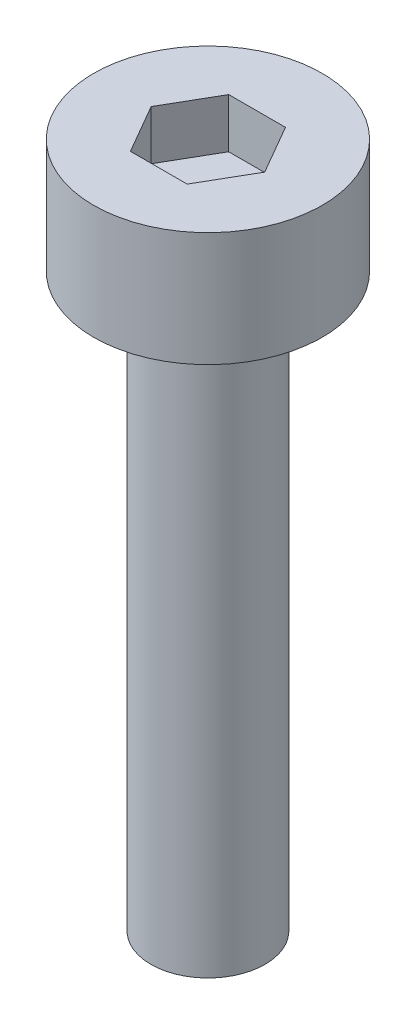
ISO-10303-21;
HEADER;
FILE_DESCRIPTION(('STEP AP214'),'2;1');
FILE_NAME('part.step','',(''),(''),'','','');
FILE_SCHEMA(('AUTOMOTIVE_DESIGN { 1 0 10303 214 1 1 1 1 }'));
ENDSEC;
DATA;
#1=APPLICATION_CONTEXT('core data for automotive mechanical design processes');
#2=APPLICATION_PROTOCOL_DEFINITION('international standard','automotive_design',2000,#1);
#3=PRODUCT_CONTEXT('',#1,'mechanical');
#4=PRODUCT('Part','Part','',(#3));
#5=PRODUCT_RELATED_PRODUCT_CATEGORY('part','',(#4));
#6=PRODUCT_DEFINITION_FORMATION('','',#4);
#7=PRODUCT_DEFINITION_CONTEXT('part definition',#1,'design');
#8=PRODUCT_DEFINITION('design','',#6,#7);
#9=PRODUCT_DEFINITION_SHAPE('','',#8);
#10=(LENGTH_UNIT() NAMED_UNIT(*) SI_UNIT(.MILLI.,.METRE.));
#11=(NAMED_UNIT(*) PLANE_ANGLE_UNIT() SI_UNIT($,.RADIAN.));
#12=(NAMED_UNIT(*) SI_UNIT($,.STERADIAN.) SOLID_ANGLE_UNIT());
#13=UNCERTAINTY_MEASURE_WITH_UNIT(LENGTH_MEASURE(1.E-05),#10,'distance_accuracy_value','');
#14=(GEOMETRIC_REPRESENTATION_CONTEXT(3) GLOBAL_UNCERTAINTY_ASSIGNED_CONTEXT((#13)) GLOBAL_UNIT_ASSIGNED_CONTEXT((#10,
#11,#12)) REPRESENTATION_CONTEXT('',''));
#15=CARTESIAN_POINT('',(0.,0.,0.));
#16=DIRECTION('',(0.,0.,1.));
#17=DIRECTION('',(1.,0.,0.));
#18=AXIS2_PLACEMENT_3D('',#15,#16,#17);
#19=CARTESIAN_POINT('',(0.,15.,0.));
#20=DIRECTION('',(0.,-1.,0.));
#21=DIRECTION('',(0.,0.,-1.));
#22=AXIS2_PLACEMENT_3D('',#19,#20,#21);
#23=CYLINDRICAL_SURFACE('',#22,1.5);
#24=CARTESIAN_POINT('',(0.,15.,0.));
#25=DIRECTION('',(0.,1.,0.));
#26=DIRECTION('',(0.,0.,1.));
#27=AXIS2_PLACEMENT_3D('',#24,#25,#26);
#28=CIRCLE('',#27,1.5);
#29=CARTESIAN_POINT('',(0.,15.,1.5));
#30=VERTEX_POINT('',#29);
#31=EDGE_CURVE('E11',#30,#30,#28,.T.);
#32=ORIENTED_EDGE('',*,*,#31,.F.);
#33=EDGE_LOOP('',(#32));
#34=FACE_BOUND('',#33,.T.);
#35=CARTESIAN_POINT('',(0.,0.,0.));
#36=DIRECTION('',(0.,1.,0.));
#37=DIRECTION('',(0.,0.,1.));
#38=AXIS2_PLACEMENT_3D('',#35,#36,#37);
#39=CIRCLE('',#38,1.5);
#40=CARTESIAN_POINT('',(0.,0.,1.5));
#41=VERTEX_POINT('',#40);
#42=EDGE_CURVE('E38',#41,#41,#39,.T.);
#43=ORIENTED_EDGE('',*,*,#42,.T.);
#44=EDGE_LOOP('',(#43));
#45=FACE_BOUND('',#44,.T.);
#46=ADVANCED_FACE('F35',(#34,#45),#23,.T.);
#47=CARTESIAN_POINT('',(0.,0.,0.));
#48=DIRECTION('',(0.,1.,0.));
#49=DIRECTION('',(0.,0.,1.));
#50=AXIS2_PLACEMENT_3D('',#47,#48,#49);
#51=PLANE('',#50);
#52=ORIENTED_EDGE('',*,*,#42,.F.);
#53=EDGE_LOOP('',(#52));
#54=FACE_BOUND('',#53,.T.);
#55=ADVANCED_FACE('F166',(#54),#51,.F.);
#56=CARTESIAN_POINT('',(0.,18.,0.));
#57=DIRECTION('',(0.,-1.,0.));
#58=DIRECTION('',(0.,0.,-1.));
#59=AXIS2_PLACEMENT_3D('',#56,#57,#58);
#60=CYLINDRICAL_SURFACE('',#59,3.);
#61=CARTESIAN_POINT('',(0.,18.,0.));
#62=DIRECTION('',(0.,1.,0.));
#63=DIRECTION('',(0.,0.,1.));
#64=AXIS2_PLACEMENT_3D('',#61,#62,#63);
#65=CIRCLE('',#64,3.);
#66=CARTESIAN_POINT('',(0.,18.,3.));
#67=VERTEX_POINT('',#66);
#68=EDGE_CURVE('E142',#67,#67,#65,.T.);
#69=ORIENTED_EDGE('',*,*,#68,.F.);
#70=EDGE_LOOP('',(#69));
#71=FACE_BOUND('',#70,.T.);
#72=CARTESIAN_POINT('',(0.,15.,0.));
#73=DIRECTION('',(0.,1.,0.));
#74=DIRECTION('',(0.,0.,1.));
#75=AXIS2_PLACEMENT_3D('',#72,#73,#74);
#76=CIRCLE('',#75,3.);
#77=CARTESIAN_POINT('',(0.,15.,3.));
#78=VERTEX_POINT('',#77);
#79=EDGE_CURVE('E136',#78,#78,#76,.T.);
#80=ORIENTED_EDGE('',*,*,#79,.T.);
#81=EDGE_LOOP('',(#80));
#82=FACE_BOUND('',#81,.T.);
#83=ADVANCED_FACE('F148',(#71,#82),#60,.T.);
#84=CARTESIAN_POINT('',(0.,18.,0.));
#85=DIRECTION('',(0.,1.,0.));
#86=DIRECTION('',(0.,0.,1.));
#87=AXIS2_PLACEMENT_3D('',#84,#85,#86);
#88=PLANE('',#87);
#89=DIRECTION('',(0.5,0.,-0.866025403784439));
#90=VECTOR('',#89,1.);
#91=CARTESIAN_POINT('',(0.744781847254617,18.,1.29));
#92=LINE('',#91,#90);
#93=CARTESIAN_POINT('',(0.744781847254617,18.,1.29));
#94=VERTEX_POINT('',#93);
#95=CARTESIAN_POINT('',(1.48956369450923,18.,0.));
#96=VERTEX_POINT('',#95);
#97=EDGE_CURVE('E49',#94,#96,#92,.T.);
#98=ORIENTED_EDGE('',*,*,#97,.F.);
#99=DIRECTION('',(1.,0.,0.));
#100=VECTOR('',#99,1.);
#101=CARTESIAN_POINT('',(-0.744781847254617,18.,1.29));
#102=LINE('',#101,#100);
#103=CARTESIAN_POINT('',(-0.744781847254617,18.,1.29));
#104=VERTEX_POINT('',#103);
#105=EDGE_CURVE('E132',#104,#94,#102,.T.);
#106=ORIENTED_EDGE('',*,*,#105,.F.);
#107=DIRECTION('',(0.5,0.,0.866025403784439));
#108=VECTOR('',#107,1.);
#109=CARTESIAN_POINT('',(-1.48956369450923,18.,0.));
#110=LINE('',#109,#108);
#111=CARTESIAN_POINT('',(-1.48956369450923,18.,0.));
#112=VERTEX_POINT('',#111);
#113=EDGE_CURVE('E130',#112,#104,#110,.T.);
#114=ORIENTED_EDGE('',*,*,#113,.F.);
#115=DIRECTION('',(-0.5,0.,0.866025403784439));
#116=VECTOR('',#115,1.);
#117=CARTESIAN_POINT('',(-0.744781847254617,18.,-1.29));
#118=LINE('',#117,#116);
#119=CARTESIAN_POINT('',(-0.744781847254617,18.,-1.29));
#120=VERTEX_POINT('',#119);
#121=EDGE_CURVE('E97',#120,#112,#118,.T.);
#122=ORIENTED_EDGE('',*,*,#121,.F.);
#123=DIRECTION('',(-1.,0.,0.));
#124=VECTOR('',#123,1.);
#125=CARTESIAN_POINT('',(0.744781847254618,18.,-1.29));
#126=LINE('',#125,#124);
#127=CARTESIAN_POINT('',(0.744781847254618,18.,-1.29));
#128=VERTEX_POINT('',#127);
#129=EDGE_CURVE('E126',#128,#120,#126,.T.);
#130=ORIENTED_EDGE('',*,*,#129,.F.);
#131=DIRECTION('',(-0.5,0.,-0.866025403784439));
#132=VECTOR('',#131,1.);
#133=CARTESIAN_POINT('',(1.48956369450923,18.,0.));
#134=LINE('',#133,#132);
#135=EDGE_CURVE('E123',#96,#128,#134,.T.);
#136=ORIENTED_EDGE('',*,*,#135,.F.);
#137=EDGE_LOOP('',(#98,#106,#114,#122,#130,#136));
#138=FACE_BOUND('',#137,.T.);
#139=ORIENTED_EDGE('',*,*,#68,.T.);
#140=EDGE_LOOP('',(#139));
#141=FACE_BOUND('',#140,.T.);
#142=ADVANCED_FACE('F153',(#138,#141),#88,.T.);
#143=CARTESIAN_POINT('',(0.,15.,0.));
#144=DIRECTION('',(0.,1.,0.));
#145=DIRECTION('',(0.,0.,1.));
#146=AXIS2_PLACEMENT_3D('',#143,#144,#145);
#147=PLANE('',#146);
#148=ORIENTED_EDGE('',*,*,#31,.T.);
#149=EDGE_LOOP('',(#148));
#150=FACE_BOUND('',#149,.T.);
#151=ORIENTED_EDGE('',*,*,#79,.F.);
#152=EDGE_LOOP('',(#151));
#153=FACE_BOUND('',#152,.T.);
#154=ADVANCED_FACE('F150',(#150,#153),#147,.F.);
#155=CARTESIAN_POINT('',(0.744781847254617,16.7,1.29));
#156=DIRECTION('',(0.866025403784439,0.,0.5));
#157=DIRECTION('',(0.5,0.,-0.866025403784439));
#158=AXIS2_PLACEMENT_3D('',#155,#156,#157);
#159=PLANE('',#158);
#160=ORIENTED_EDGE('',*,*,#97,.T.);
#161=DIRECTION('',(0.,1.,0.));
#162=VECTOR('',#161,1.);
#163=CARTESIAN_POINT('',(1.48956369450923,16.7,0.));
#164=LINE('',#163,#162);
#165=CARTESIAN_POINT('',(1.48956369450923,16.7,0.));
#166=VERTEX_POINT('',#165);
#167=EDGE_CURVE('E79',#166,#96,#164,.T.);
#168=ORIENTED_EDGE('',*,*,#167,.F.);
#169=DIRECTION('',(0.5,0.,-0.866025403784439));
#170=VECTOR('',#169,1.);
#171=CARTESIAN_POINT('',(0.744781847254617,16.7,1.29));
#172=LINE('',#171,#170);
#173=CARTESIAN_POINT('',(0.744781847254617,16.7,1.29));
#174=VERTEX_POINT('',#173);
#175=EDGE_CURVE('E134',#174,#166,#172,.T.);
#176=ORIENTED_EDGE('',*,*,#175,.F.);
#177=DIRECTION('',(0.,1.,0.));
#178=VECTOR('',#177,1.);
#179=CARTESIAN_POINT('',(0.744781847254617,16.7,1.29));
#180=LINE('',#179,#178);
#181=EDGE_CURVE('E57',#174,#94,#180,.T.);
#182=ORIENTED_EDGE('',*,*,#181,.T.);
#183=EDGE_LOOP('',(#160,#168,#176,#182));
#184=FACE_BOUND('',#183,.T.);
#185=ADVANCED_FACE('F152',(#184),#159,.F.);
#186=CARTESIAN_POINT('',(-0.744781847254617,16.7,1.29));
#187=DIRECTION('',(0.,0.,1.));
#188=DIRECTION('',(1.,0.,0.));
#189=AXIS2_PLACEMENT_3D('',#186,#187,#188);
#190=PLANE('',#189);
#191=ORIENTED_EDGE('',*,*,#105,.T.);
#192=ORIENTED_EDGE('',*,*,#181,.F.);
#193=DIRECTION('',(1.,0.,0.));
#194=VECTOR('',#193,1.);
#195=CARTESIAN_POINT('',(-0.744781847254617,16.7,1.29));
#196=LINE('',#195,#194);
#197=CARTESIAN_POINT('',(-0.744781847254617,16.7,1.29));
#198=VERTEX_POINT('',#197);
#199=EDGE_CURVE('E109',#198,#174,#196,.T.);
#200=ORIENTED_EDGE('',*,*,#199,.F.);
#201=DIRECTION('',(0.,1.,0.));
#202=VECTOR('',#201,1.);
#203=CARTESIAN_POINT('',(-0.744781847254617,16.7,1.29));
#204=LINE('',#203,#202);
#205=EDGE_CURVE('E101',#198,#104,#204,.T.);
#206=ORIENTED_EDGE('',*,*,#205,.T.);
#207=EDGE_LOOP('',(#191,#192,#200,#206));
#208=FACE_BOUND('',#207,.T.);
#209=ADVANCED_FACE('F160',(#208),#190,.F.);
#210=CARTESIAN_POINT('',(-1.48956369450923,16.7,0.));
#211=DIRECTION('',(-0.866025403784439,0.,0.5));
#212=DIRECTION('',(0.5,0.,0.866025403784439));
#213=AXIS2_PLACEMENT_3D('',#210,#211,#212);
#214=PLANE('',#213);
#215=ORIENTED_EDGE('',*,*,#113,.T.);
#216=ORIENTED_EDGE('',*,*,#205,.F.);
#217=DIRECTION('',(0.5,0.,0.866025403784439));
#218=VECTOR('',#217,1.);
#219=CARTESIAN_POINT('',(-1.48956369450923,16.7,0.));
#220=LINE('',#219,#218);
#221=CARTESIAN_POINT('',(-1.48956369450923,16.7,0.));
#222=VERTEX_POINT('',#221);
#223=EDGE_CURVE('E105',#222,#198,#220,.T.);
#224=ORIENTED_EDGE('',*,*,#223,.F.);
#225=DIRECTION('',(0.,1.,0.));
#226=VECTOR('',#225,1.);
#227=CARTESIAN_POINT('',(-1.48956369450923,16.7,0.));
#228=LINE('',#227,#226);
#229=EDGE_CURVE('E90',#222,#112,#228,.T.);
#230=ORIENTED_EDGE('',*,*,#229,.T.);
#231=EDGE_LOOP('',(#215,#216,#224,#230));
#232=FACE_BOUND('',#231,.T.);
#233=ADVANCED_FACE('F106',(#232),#214,.F.);
#234=CARTESIAN_POINT('',(-0.744781847254617,16.7,-1.29));
#235=DIRECTION('',(-0.866025403784439,0.,-0.5));
#236=DIRECTION('',(-0.5,0.,0.866025403784439));
#237=AXIS2_PLACEMENT_3D('',#234,#235,#236);
#238=PLANE('',#237);
#239=ORIENTED_EDGE('',*,*,#121,.T.);
#240=ORIENTED_EDGE('',*,*,#229,.F.);
#241=DIRECTION('',(-0.5,0.,0.866025403784439));
#242=VECTOR('',#241,1.);
#243=CARTESIAN_POINT('',(-0.744781847254617,16.7,-1.29));
#244=LINE('',#243,#242);
#245=CARTESIAN_POINT('',(-0.744781847254617,16.7,-1.29));
#246=VERTEX_POINT('',#245);
#247=EDGE_CURVE('E94',#246,#222,#244,.T.);
#248=ORIENTED_EDGE('',*,*,#247,.F.);
#249=DIRECTION('',(0.,1.,0.));
#250=VECTOR('',#249,1.);
#251=CARTESIAN_POINT('',(-0.744781847254617,16.7,-1.29));
#252=LINE('',#251,#250);
#253=EDGE_CURVE('E102',#246,#120,#252,.T.);
#254=ORIENTED_EDGE('',*,*,#253,.T.);
#255=EDGE_LOOP('',(#239,#240,#248,#254));
#256=FACE_BOUND('',#255,.T.);
#257=ADVANCED_FACE('F92',(#256),#238,.F.);
#258=CARTESIAN_POINT('',(0.744781847254618,16.7,-1.29));
#259=DIRECTION('',(0.,0.,-1.));
#260=DIRECTION('',(-1.,0.,0.));
#261=AXIS2_PLACEMENT_3D('',#258,#259,#260);
#262=PLANE('',#261);
#263=ORIENTED_EDGE('',*,*,#129,.T.);
#264=ORIENTED_EDGE('',*,*,#253,.F.);
#265=DIRECTION('',(-1.,0.,0.));
#266=VECTOR('',#265,1.);
#267=CARTESIAN_POINT('',(0.744781847254618,16.7,-1.29));
#268=LINE('',#267,#266);
#269=CARTESIAN_POINT('',(0.744781847254618,16.7,-1.29));
#270=VERTEX_POINT('',#269);
#271=EDGE_CURVE('E115',#270,#246,#268,.T.);
#272=ORIENTED_EDGE('',*,*,#271,.F.);
#273=DIRECTION('',(0.,1.,0.));
#274=VECTOR('',#273,1.);
#275=CARTESIAN_POINT('',(0.744781847254618,16.7,-1.29));
#276=LINE('',#275,#274);
#277=EDGE_CURVE('E139',#270,#128,#276,.T.);
#278=ORIENTED_EDGE('',*,*,#277,.T.);
#279=EDGE_LOOP('',(#263,#264,#272,#278));
#280=FACE_BOUND('',#279,.T.);
#281=ADVANCED_FACE('F221',(#280),#262,.F.);
#282=CARTESIAN_POINT('',(1.48956369450923,16.7,0.));
#283=DIRECTION('',(0.866025403784439,0.,-0.5));
#284=DIRECTION('',(-0.5,0.,-0.866025403784439));
#285=AXIS2_PLACEMENT_3D('',#282,#283,#284);
#286=PLANE('',#285);
#287=ORIENTED_EDGE('',*,*,#135,.T.);
#288=ORIENTED_EDGE('',*,*,#277,.F.);
#289=DIRECTION('',(-0.5,0.,-0.866025403784439));
#290=VECTOR('',#289,1.);
#291=CARTESIAN_POINT('',(1.48956369450923,16.7,0.));
#292=LINE('',#291,#290);
#293=EDGE_CURVE('E117',#166,#270,#292,.T.);
#294=ORIENTED_EDGE('',*,*,#293,.F.);
#295=ORIENTED_EDGE('',*,*,#167,.T.);
#296=EDGE_LOOP('',(#287,#288,#294,#295));
#297=FACE_BOUND('',#296,.T.);
#298=ADVANCED_FACE('F230',(#297),#286,.F.);
#299=CARTESIAN_POINT('',(0.,16.7,0.));
#300=DIRECTION('',(0.,1.,0.));
#301=DIRECTION('',(0.,0.,1.));
#302=AXIS2_PLACEMENT_3D('',#299,#300,#301);
#303=PLANE('',#302);
#304=ORIENTED_EDGE('',*,*,#175,.T.);
#305=ORIENTED_EDGE('',*,*,#293,.T.);
#306=ORIENTED_EDGE('',*,*,#271,.T.);
#307=ORIENTED_EDGE('',*,*,#247,.T.);
#308=ORIENTED_EDGE('',*,*,#223,.T.);
#309=ORIENTED_EDGE('',*,*,#199,.T.);
#310=EDGE_LOOP('',(#304,#305,#306,#307,#308,#309));
#311=FACE_BOUND('',#310,.T.);
#312=ADVANCED_FACE('F112',(#311),#303,.T.);
#313=CLOSED_SHELL('',(#46,#55,#83,#142,#154,#185,#209,#233,#257,#281,#298,#312));
#314=MANIFOLD_SOLID_BREP('B2',#313);
#315=ADVANCED_BREP_SHAPE_REPRESENTATION('',(#18,#314),#14);
#316=SHAPE_DEFINITION_REPRESENTATION(#9,#315);
ENDSEC;
END-ISO-10303-21;
